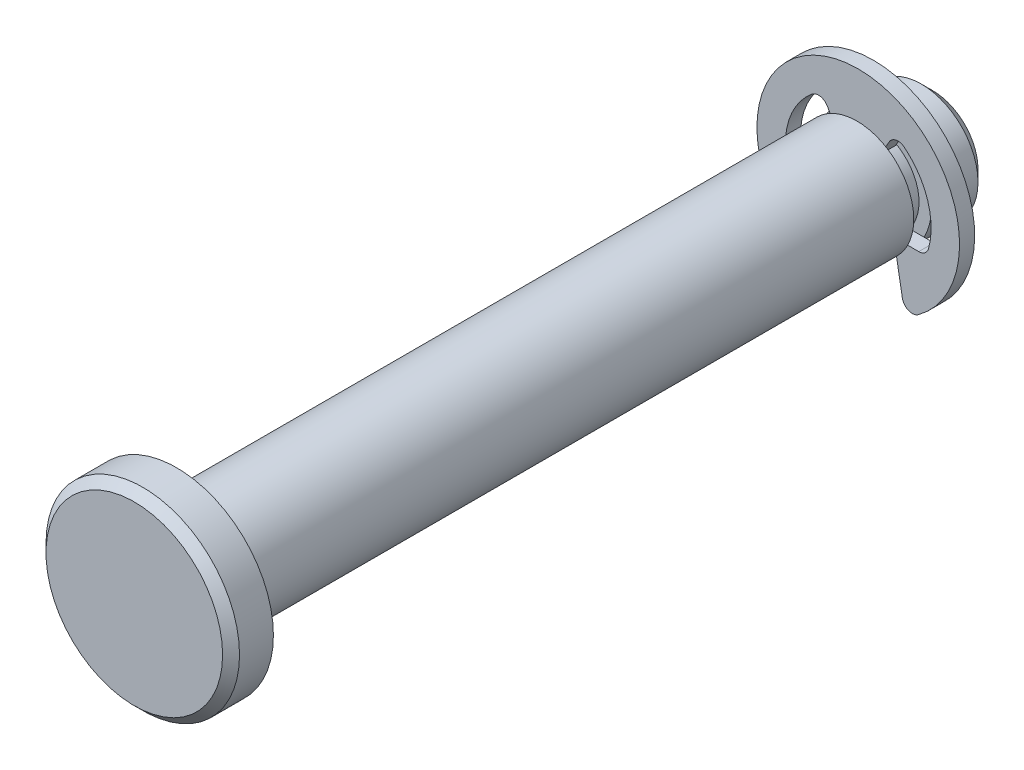
ISO-10303-21;
HEADER;
FILE_DESCRIPTION(('STEP AP214'),'2;1');
FILE_NAME('part.step','',(''),(''),'','','');
FILE_SCHEMA(('AUTOMOTIVE_DESIGN { 1 0 10303 214 1 1 1 1 }'));
ENDSEC;
DATA;
#1=APPLICATION_CONTEXT('core data for automotive mechanical design processes');
#2=APPLICATION_PROTOCOL_DEFINITION('international standard','automotive_design',2000,#1);
#3=PRODUCT_CONTEXT('',#1,'mechanical');
#4=PRODUCT('Part','Part','',(#3));
#5=PRODUCT_RELATED_PRODUCT_CATEGORY('part','',(#4));
#6=PRODUCT_DEFINITION_FORMATION('','',#4);
#7=PRODUCT_DEFINITION_CONTEXT('part definition',#1,'design');
#8=PRODUCT_DEFINITION('design','',#6,#7);
#9=PRODUCT_DEFINITION_SHAPE('','',#8);
#10=(LENGTH_UNIT() NAMED_UNIT(*) SI_UNIT(.MILLI.,.METRE.));
#11=(NAMED_UNIT(*) PLANE_ANGLE_UNIT() SI_UNIT($,.RADIAN.));
#12=(NAMED_UNIT(*) SI_UNIT($,.STERADIAN.) SOLID_ANGLE_UNIT());
#13=UNCERTAINTY_MEASURE_WITH_UNIT(LENGTH_MEASURE(1.E-05),#10,'distance_accuracy_value','');
#14=(GEOMETRIC_REPRESENTATION_CONTEXT(3) GLOBAL_UNCERTAINTY_ASSIGNED_CONTEXT((#13)) GLOBAL_UNIT_ASSIGNED_CONTEXT((#10,
#11,#12)) REPRESENTATION_CONTEXT('',''));
#15=CARTESIAN_POINT('',(0.,0.,0.));
#16=DIRECTION('',(0.,0.,1.));
#17=DIRECTION('',(1.,0.,0.));
#18=AXIS2_PLACEMENT_3D('',#15,#16,#17);
#19=CARTESIAN_POINT('',(0.,0.,-12.7508));
#20=DIRECTION('',(0.,0.,1.));
#21=DIRECTION('',(1.,0.,0.));
#22=AXIS2_PLACEMENT_3D('',#19,#20,#21);
#23=PLANE('',#22);
#24=DIRECTION('',(-0.173648177666931,0.984807753012208,0.));
#25=VECTOR('',#24,1.);
#26=CARTESIAN_POINT('',(1.25692963982568,0.22163060835344,-12.7508));
#27=LINE('',#26,#25);
#28=CARTESIAN_POINT('',(1.85256069501915,-3.15636096616503,-12.7508));
#29=VERTEX_POINT('',#28);
#30=CARTESIAN_POINT('',(1.49352,-1.12014,-12.7508));
#31=VERTEX_POINT('',#30);
#32=EDGE_CURVE('E199',#29,#31,#27,.T.);
#33=ORIENTED_EDGE('',*,*,#32,.F.);
#34=CARTESIAN_POINT('',(2.2715471535382,-3.08248234897663,-12.7508));
#35=DIRECTION('',(0.,0.,1.));
#36=DIRECTION('',(1.,0.,0.));
#37=AXIS2_PLACEMENT_3D('',#34,#35,#36);
#38=CIRCLE('',#37,0.42545);
#39=CARTESIAN_POINT('',(2.52394128170911,-3.42498038775182,-12.7508));
#40=VERTEX_POINT('',#39);
#41=EDGE_CURVE('E253',#29,#40,#38,.T.);
#42=ORIENTED_EDGE('',*,*,#41,.T.);
#43=CARTESIAN_POINT('',(0.,0.,-12.7508));
#44=DIRECTION('',(0.,0.,1.));
#45=DIRECTION('',(1.,0.,0.));
#46=AXIS2_PLACEMENT_3D('',#43,#44,#45);
#47=CIRCLE('',#46,4.2545);
#48=CARTESIAN_POINT('',(-2.52394128170911,-3.42498038775182,-12.7508));
#49=VERTEX_POINT('',#48);
#50=EDGE_CURVE('E179',#40,#49,#47,.T.);
#51=ORIENTED_EDGE('',*,*,#50,.T.);
#52=CARTESIAN_POINT('',(-2.2715471535382,-3.08248234897663,-12.7508));
#53=DIRECTION('',(0.,0.,1.));
#54=DIRECTION('',(1.,0.,0.));
#55=AXIS2_PLACEMENT_3D('',#52,#53,#54);
#56=CIRCLE('',#55,0.42545);
#57=CARTESIAN_POINT('',(-1.85256069501915,-3.15636096616503,-12.7508));
#58=VERTEX_POINT('',#57);
#59=EDGE_CURVE('E251',#49,#58,#56,.T.);
#60=ORIENTED_EDGE('',*,*,#59,.T.);
#61=DIRECTION('',(-0.173648177666931,-0.984807753012208,0.));
#62=VECTOR('',#61,1.);
#63=CARTESIAN_POINT('',(-1.25692963982568,0.22163060835344,-12.7508));
#64=LINE('',#63,#62);
#65=CARTESIAN_POINT('',(-1.49352,-1.12014,-12.7508));
#66=VERTEX_POINT('',#65);
#67=EDGE_CURVE('E195',#66,#58,#64,.T.);
#68=ORIENTED_EDGE('',*,*,#67,.F.);
#69=DIRECTION('',(1.,0.,0.));
#70=VECTOR('',#69,1.);
#71=CARTESIAN_POINT('',(0.,-1.12014,-12.7508));
#72=LINE('',#71,#70);
#73=CARTESIAN_POINT('',(-2.54203626378539,-1.12014,-12.7508));
#74=VERTEX_POINT('',#73);
#75=EDGE_CURVE('E186',#74,#66,#72,.T.);
#76=ORIENTED_EDGE('',*,*,#75,.F.);
#77=CARTESIAN_POINT('',(-2.54203626378539,-0.69469,-12.7508));
#78=DIRECTION('',(0.,0.,1.));
#79=DIRECTION('',(1.,0.,0.));
#80=AXIS2_PLACEMENT_3D('',#77,#78,#79);
#81=CIRCLE('',#80,0.42545);
#82=CARTESIAN_POINT('',(-2.95243729914352,-0.806844771084337,-12.7508));
#83=VERTEX_POINT('',#82);
#84=EDGE_CURVE('E51',#74,#83,#81,.F.);
#85=ORIENTED_EDGE('',*,*,#84,.T.);
#86=CARTESIAN_POINT('',(0.,0.,-12.7508));
#87=DIRECTION('',(0.,0.,1.));
#88=DIRECTION('',(1.,0.,0.));
#89=AXIS2_PLACEMENT_3D('',#86,#87,#88);
#90=CIRCLE('',#89,3.0607);
#91=CARTESIAN_POINT('',(-1.93820951958955,2.36880314677528,-12.7508));
#92=VERTEX_POINT('',#91);
#93=EDGE_CURVE('E211',#92,#83,#90,.T.);
#94=ORIENTED_EDGE('',*,*,#93,.F.);
#95=CARTESIAN_POINT('',(-1.66879035400345,2.03952968031481,-12.7508));
#96=DIRECTION('',(0.,0.,1.));
#97=DIRECTION('',(1.,0.,0.));
#98=AXIS2_PLACEMENT_3D('',#95,#96,#97);
#99=CIRCLE('',#98,0.42545);
#100=CARTESIAN_POINT('',(-1.30033984596336,2.25225468031482,-12.7508));
#101=VERTEX_POINT('',#100);
#102=EDGE_CURVE('E183',#92,#101,#99,.F.);
#103=ORIENTED_EDGE('',*,*,#102,.T.);
#104=DIRECTION('',(-0.500000000000002,0.866025403784438,0.));
#105=VECTOR('',#104,1.);
#106=CARTESIAN_POINT('',(0.,0.,-12.7508));
#107=LINE('',#106,#105);
#108=CARTESIAN_POINT('',(-0.933450000000003,1.61678282632517,-12.7508));
#109=VERTEX_POINT('',#108);
#110=EDGE_CURVE('E175',#109,#101,#107,.T.);
#111=ORIENTED_EDGE('',*,*,#110,.F.);
#112=DIRECTION('',(1.,0.,0.));
#113=VECTOR('',#112,1.);
#114=CARTESIAN_POINT('',(-0.933450000000003,1.61678282632517,-12.7508));
#115=LINE('',#114,#113);
#116=CARTESIAN_POINT('',(0.933450000000003,1.61678282632517,-12.7508));
#117=VERTEX_POINT('',#116);
#118=EDGE_CURVE('E159',#109,#117,#115,.T.);
#119=ORIENTED_EDGE('',*,*,#118,.T.);
#120=DIRECTION('',(-0.500000000000002,-0.866025403784438,0.));
#121=VECTOR('',#120,1.);
#122=CARTESIAN_POINT('',(0.,0.,-12.7508));
#123=LINE('',#122,#121);
#124=CARTESIAN_POINT('',(1.30033984596336,2.25225468031482,-12.7508));
#125=VERTEX_POINT('',#124);
#126=EDGE_CURVE('E209',#125,#117,#123,.T.);
#127=ORIENTED_EDGE('',*,*,#126,.F.);
#128=CARTESIAN_POINT('',(1.66879035400345,2.03952968031482,-12.7508));
#129=DIRECTION('',(0.,0.,1.));
#130=DIRECTION('',(1.,0.,0.));
#131=AXIS2_PLACEMENT_3D('',#128,#129,#130);
#132=CIRCLE('',#131,0.42545);
#133=CARTESIAN_POINT('',(1.93820951958955,2.36880314677528,-12.7508));
#134=VERTEX_POINT('',#133);
#135=EDGE_CURVE('E268',#125,#134,#132,.F.);
#136=ORIENTED_EDGE('',*,*,#135,.T.);
#137=CARTESIAN_POINT('',(0.,0.,-12.7508));
#138=DIRECTION('',(0.,0.,1.));
#139=DIRECTION('',(1.,0.,0.));
#140=AXIS2_PLACEMENT_3D('',#137,#138,#139);
#141=CIRCLE('',#140,3.0607);
#142=CARTESIAN_POINT('',(2.95243729914352,-0.806844771084337,-12.7508));
#143=VERTEX_POINT('',#142);
#144=EDGE_CURVE('E214',#143,#134,#141,.T.);
#145=ORIENTED_EDGE('',*,*,#144,.F.);
#146=CARTESIAN_POINT('',(2.54203626378539,-0.69469,-12.7508));
#147=DIRECTION('',(0.,0.,1.));
#148=DIRECTION('',(1.,0.,0.));
#149=AXIS2_PLACEMENT_3D('',#146,#147,#148);
#150=CIRCLE('',#149,0.42545);
#151=CARTESIAN_POINT('',(2.54203626378539,-1.12014,-12.7508));
#152=VERTEX_POINT('',#151);
#153=EDGE_CURVE('E264',#143,#152,#150,.F.);
#154=ORIENTED_EDGE('',*,*,#153,.T.);
#155=DIRECTION('',(1.,0.,0.));
#156=VECTOR('',#155,1.);
#157=CARTESIAN_POINT('',(0.,-1.12014,-12.7508));
#158=LINE('',#157,#156);
#159=EDGE_CURVE('E204',#31,#152,#158,.T.);
#160=ORIENTED_EDGE('',*,*,#159,.F.);
#161=EDGE_LOOP('',(#33,#42,#51,#60,#68,#76,#85,#94,#103,#111,#119,#127,#136,#145,#154,#160));
#162=FACE_BOUND('',#161,.T.);
#163=ADVANCED_FACE('F43',(#162),#23,.T.);
#164=CARTESIAN_POINT('',(0.,0.,-13.3858));
#165=DIRECTION('',(0.,0.,1.));
#166=DIRECTION('',(1.,0.,0.));
#167=AXIS2_PLACEMENT_3D('',#164,#165,#166);
#168=PLANE('',#167);
#169=CARTESIAN_POINT('',(0.,0.,-13.3858));
#170=DIRECTION('',(0.,0.,1.));
#171=DIRECTION('',(1.,0.,0.));
#172=AXIS2_PLACEMENT_3D('',#169,#170,#171);
#173=CIRCLE('',#172,4.2545);
#174=CARTESIAN_POINT('',(2.52394128170911,-3.42498038775182,-13.3858));
#175=VERTEX_POINT('',#174);
#176=CARTESIAN_POINT('',(-2.52394128170911,-3.42498038775182,-13.3858));
#177=VERTEX_POINT('',#176);
#178=EDGE_CURVE('E217',#175,#177,#173,.T.);
#179=ORIENTED_EDGE('',*,*,#178,.F.);
#180=CARTESIAN_POINT('',(2.2715471535382,-3.08248234897663,-13.3858));
#181=DIRECTION('',(0.,0.,1.));
#182=DIRECTION('',(1.,0.,0.));
#183=AXIS2_PLACEMENT_3D('',#180,#181,#182);
#184=CIRCLE('',#183,0.42545);
#185=CARTESIAN_POINT('',(1.85256069501915,-3.15636096616503,-13.3858));
#186=VERTEX_POINT('',#185);
#187=EDGE_CURVE('E261',#175,#186,#184,.F.);
#188=ORIENTED_EDGE('',*,*,#187,.T.);
#189=DIRECTION('',(-0.173648177666931,0.984807753012208,0.));
#190=VECTOR('',#189,1.);
#191=CARTESIAN_POINT('',(1.25692963982568,0.22163060835344,-13.3858));
#192=LINE('',#191,#190);
#193=CARTESIAN_POINT('',(1.49352,-1.12014,-13.3858));
#194=VERTEX_POINT('',#193);
#195=EDGE_CURVE('E197',#186,#194,#192,.T.);
#196=ORIENTED_EDGE('',*,*,#195,.T.);
#197=DIRECTION('',(1.,0.,0.));
#198=VECTOR('',#197,1.);
#199=CARTESIAN_POINT('',(0.,-1.12014,-13.3858));
#200=LINE('',#199,#198);
#201=CARTESIAN_POINT('',(2.54203626378539,-1.12014,-13.3858));
#202=VERTEX_POINT('',#201);
#203=EDGE_CURVE('E201',#194,#202,#200,.T.);
#204=ORIENTED_EDGE('',*,*,#203,.T.);
#205=CARTESIAN_POINT('',(2.54203626378539,-0.69469,-13.3858));
#206=DIRECTION('',(0.,0.,1.));
#207=DIRECTION('',(1.,0.,0.));
#208=AXIS2_PLACEMENT_3D('',#205,#206,#207);
#209=CIRCLE('',#208,0.42545);
#210=CARTESIAN_POINT('',(2.95243729914352,-0.806844771084337,-13.3858));
#211=VERTEX_POINT('',#210);
#212=EDGE_CURVE('E266',#202,#211,#209,.T.);
#213=ORIENTED_EDGE('',*,*,#212,.T.);
#214=CARTESIAN_POINT('',(0.,0.,-13.3858));
#215=DIRECTION('',(0.,0.,1.));
#216=DIRECTION('',(1.,0.,0.));
#217=AXIS2_PLACEMENT_3D('',#214,#215,#216);
#218=CIRCLE('',#217,3.0607);
#219=CARTESIAN_POINT('',(1.93820951958955,2.36880314677528,-13.3858));
#220=VERTEX_POINT('',#219);
#221=EDGE_CURVE('E225',#211,#220,#218,.T.);
#222=ORIENTED_EDGE('',*,*,#221,.T.);
#223=CARTESIAN_POINT('',(1.66879035400345,2.03952968031482,-13.3858));
#224=DIRECTION('',(0.,0.,1.));
#225=DIRECTION('',(1.,0.,0.));
#226=AXIS2_PLACEMENT_3D('',#223,#224,#225);
#227=CIRCLE('',#226,0.42545);
#228=CARTESIAN_POINT('',(1.30033984596336,2.25225468031482,-13.3858));
#229=VERTEX_POINT('',#228);
#230=EDGE_CURVE('E270',#220,#229,#227,.T.);
#231=ORIENTED_EDGE('',*,*,#230,.T.);
#232=DIRECTION('',(-0.500000000000002,-0.866025403784438,0.));
#233=VECTOR('',#232,1.);
#234=CARTESIAN_POINT('',(0.,0.,-13.3858));
#235=LINE('',#234,#233);
#236=CARTESIAN_POINT('',(0.933450000000003,1.61678282632517,-13.3858));
#237=VERTEX_POINT('',#236);
#238=EDGE_CURVE('E207',#229,#237,#235,.T.);
#239=ORIENTED_EDGE('',*,*,#238,.T.);
#240=DIRECTION('',(-1.,0.,0.));
#241=VECTOR('',#240,1.);
#242=CARTESIAN_POINT('',(-0.933450000000003,1.61678282632517,-13.3858));
#243=LINE('',#242,#241);
#244=CARTESIAN_POINT('',(-0.933450000000003,1.61678282632517,-13.3858));
#245=VERTEX_POINT('',#244);
#246=EDGE_CURVE('E170',#237,#245,#243,.T.);
#247=ORIENTED_EDGE('',*,*,#246,.T.);
#248=DIRECTION('',(-0.500000000000002,0.866025403784438,0.));
#249=VECTOR('',#248,1.);
#250=CARTESIAN_POINT('',(0.,0.,-13.3858));
#251=LINE('',#250,#249);
#252=CARTESIAN_POINT('',(-1.30033984596336,2.25225468031482,-13.3858));
#253=VERTEX_POINT('',#252);
#254=EDGE_CURVE('E178',#245,#253,#251,.T.);
#255=ORIENTED_EDGE('',*,*,#254,.T.);
#256=CARTESIAN_POINT('',(-1.66879035400345,2.03952968031481,-13.3858));
#257=DIRECTION('',(0.,0.,1.));
#258=DIRECTION('',(1.,0.,0.));
#259=AXIS2_PLACEMENT_3D('',#256,#257,#258);
#260=CIRCLE('',#259,0.42545);
#261=CARTESIAN_POINT('',(-1.93820951958955,2.36880314677528,-13.3858));
#262=VERTEX_POINT('',#261);
#263=EDGE_CURVE('E273',#253,#262,#260,.T.);
#264=ORIENTED_EDGE('',*,*,#263,.T.);
#265=CARTESIAN_POINT('',(0.,0.,-13.3858));
#266=DIRECTION('',(0.,0.,1.));
#267=DIRECTION('',(1.,0.,0.));
#268=AXIS2_PLACEMENT_3D('',#265,#266,#267);
#269=CIRCLE('',#268,3.0607);
#270=CARTESIAN_POINT('',(-2.95243729914352,-0.806844771084337,-13.3858));
#271=VERTEX_POINT('',#270);
#272=EDGE_CURVE('E222',#262,#271,#269,.T.);
#273=ORIENTED_EDGE('',*,*,#272,.T.);
#274=CARTESIAN_POINT('',(-2.54203626378539,-0.69469,-13.3858));
#275=DIRECTION('',(0.,0.,1.));
#276=DIRECTION('',(1.,0.,0.));
#277=AXIS2_PLACEMENT_3D('',#274,#275,#276);
#278=CIRCLE('',#277,0.42545);
#279=CARTESIAN_POINT('',(-2.54203626378539,-1.12014,-13.3858));
#280=VERTEX_POINT('',#279);
#281=EDGE_CURVE('E12',#271,#280,#278,.T.);
#282=ORIENTED_EDGE('',*,*,#281,.T.);
#283=DIRECTION('',(1.,0.,0.));
#284=VECTOR('',#283,1.);
#285=CARTESIAN_POINT('',(0.,-1.12014,-13.3858));
#286=LINE('',#285,#284);
#287=CARTESIAN_POINT('',(-1.49352,-1.12014,-13.3858));
#288=VERTEX_POINT('',#287);
#289=EDGE_CURVE('E184',#280,#288,#286,.T.);
#290=ORIENTED_EDGE('',*,*,#289,.T.);
#291=DIRECTION('',(-0.173648177666931,-0.984807753012208,0.));
#292=VECTOR('',#291,1.);
#293=CARTESIAN_POINT('',(-1.25692963982568,0.22163060835344,-13.3858));
#294=LINE('',#293,#292);
#295=CARTESIAN_POINT('',(-1.85256069501915,-3.15636096616503,-13.3858));
#296=VERTEX_POINT('',#295);
#297=EDGE_CURVE('E193',#288,#296,#294,.T.);
#298=ORIENTED_EDGE('',*,*,#297,.T.);
#299=CARTESIAN_POINT('',(-2.2715471535382,-3.08248234897663,-13.3858));
#300=DIRECTION('',(0.,0.,1.));
#301=DIRECTION('',(1.,0.,0.));
#302=AXIS2_PLACEMENT_3D('',#299,#300,#301);
#303=CIRCLE('',#302,0.42545);
#304=EDGE_CURVE('E65',#296,#177,#303,.F.);
#305=ORIENTED_EDGE('',*,*,#304,.T.);
#306=EDGE_LOOP('',(#179,#188,#196,#204,#213,#222,#231,#239,#247,#255,#264,#273,#282,#290,#298,#305));
#307=FACE_BOUND('',#306,.T.);
#308=ADVANCED_FACE('F286',(#307),#168,.F.);
#309=CARTESIAN_POINT('',(0.,0.,-12.7508));
#310=DIRECTION('',(0.,0.,-1.));
#311=DIRECTION('',(-1.,0.,0.));
#312=AXIS2_PLACEMENT_3D('',#309,#310,#311);
#313=CYLINDRICAL_SURFACE('',#312,4.2545);
#314=ORIENTED_EDGE('',*,*,#50,.F.);
#315=DIRECTION('',(0.,0.,-1.));
#316=VECTOR('',#315,1.);
#317=CARTESIAN_POINT('',(2.52394128170911,-3.42498038775182,-12.7508));
#318=LINE('',#317,#316);
#319=EDGE_CURVE('E258',#40,#175,#318,.T.);
#320=ORIENTED_EDGE('',*,*,#319,.T.);
#321=ORIENTED_EDGE('',*,*,#178,.T.);
#322=DIRECTION('',(0.,0.,-1.));
#323=VECTOR('',#322,1.);
#324=CARTESIAN_POINT('',(-2.52394128170911,-3.42498038775182,-12.7508));
#325=LINE('',#324,#323);
#326=EDGE_CURVE('E255',#177,#49,#325,.F.);
#327=ORIENTED_EDGE('',*,*,#326,.T.);
#328=EDGE_LOOP('',(#314,#320,#321,#327));
#329=FACE_BOUND('',#328,.T.);
#330=ADVANCED_FACE('F326',(#329),#313,.T.);
#331=CARTESIAN_POINT('',(-1.49352,-1.12014,-15.875));
#332=DIRECTION('',(-0.984807753012208,0.173648177666931,0.));
#333=DIRECTION('',(-0.173648177666931,-0.984807753012208,0.));
#334=AXIS2_PLACEMENT_3D('',#331,#332,#333);
#335=PLANE('',#334);
#336=ORIENTED_EDGE('',*,*,#67,.T.);
#337=DIRECTION('',(0.,0.,-1.));
#338=VECTOR('',#337,1.);
#339=CARTESIAN_POINT('',(-1.85256069501915,-3.15636096616503,-15.875));
#340=LINE('',#339,#338);
#341=EDGE_CURVE('E58',#58,#296,#340,.T.);
#342=ORIENTED_EDGE('',*,*,#341,.T.);
#343=ORIENTED_EDGE('',*,*,#297,.F.);
#344=DIRECTION('',(0.,0.,1.));
#345=VECTOR('',#344,1.);
#346=CARTESIAN_POINT('',(-1.49352,-1.12014,-15.875));
#347=LINE('',#346,#345);
#348=EDGE_CURVE('E291',#288,#66,#347,.T.);
#349=ORIENTED_EDGE('',*,*,#348,.T.);
#350=EDGE_LOOP('',(#336,#342,#343,#349));
#351=FACE_BOUND('',#350,.T.);
#352=ADVANCED_FACE('F331',(#351),#335,.F.);
#353=CARTESIAN_POINT('',(-1.53035,2.65064395336303,-15.875));
#354=DIRECTION('',(0.866025403784438,0.500000000000002,0.));
#355=DIRECTION('',(-0.500000000000002,0.866025403784438,0.));
#356=AXIS2_PLACEMENT_3D('',#353,#354,#355);
#357=PLANE('',#356);
#358=ORIENTED_EDGE('',*,*,#110,.T.);
#359=DIRECTION('',(0.,0.,-1.));
#360=VECTOR('',#359,1.);
#361=CARTESIAN_POINT('',(-1.30033984596336,2.25225468031482,-13.3858));
#362=LINE('',#361,#360);
#363=EDGE_CURVE('E243',#101,#253,#362,.T.);
#364=ORIENTED_EDGE('',*,*,#363,.T.);
#365=ORIENTED_EDGE('',*,*,#254,.F.);
#366=DIRECTION('',(0.,0.,-1.));
#367=VECTOR('',#366,1.);
#368=CARTESIAN_POINT('',(-0.933450000000003,1.61678282632517,-12.7508));
#369=LINE('',#368,#367);
#370=EDGE_CURVE('E163',#245,#109,#369,.F.);
#371=ORIENTED_EDGE('',*,*,#370,.T.);
#372=EDGE_LOOP('',(#358,#364,#365,#371));
#373=FACE_BOUND('',#372,.T.);
#374=ADVANCED_FACE('F174',(#373),#357,.F.);
#375=CARTESIAN_POINT('',(0.,0.,-15.875));
#376=DIRECTION('',(0.,0.,1.));
#377=DIRECTION('',(1.,0.,0.));
#378=AXIS2_PLACEMENT_3D('',#375,#376,#377);
#379=CYLINDRICAL_SURFACE('',#378,3.0607);
#380=ORIENTED_EDGE('',*,*,#272,.F.);
#381=DIRECTION('',(0.,0.,1.));
#382=VECTOR('',#381,1.);
#383=CARTESIAN_POINT('',(-1.93820951958955,2.36880314677528,-15.875));
#384=LINE('',#383,#382);
#385=EDGE_CURVE('E240',#262,#92,#384,.T.);
#386=ORIENTED_EDGE('',*,*,#385,.T.);
#387=ORIENTED_EDGE('',*,*,#93,.T.);
#388=DIRECTION('',(0.,0.,1.));
#389=VECTOR('',#388,1.);
#390=CARTESIAN_POINT('',(-2.95243729914352,-0.806844771084337,-15.875));
#391=LINE('',#390,#389);
#392=EDGE_CURVE('E238',#83,#271,#391,.F.);
#393=ORIENTED_EDGE('',*,*,#392,.T.);
#394=EDGE_LOOP('',(#380,#386,#387,#393));
#395=FACE_BOUND('',#394,.T.);
#396=ADVANCED_FACE('F281',(#395),#379,.F.);
#397=CARTESIAN_POINT('',(-2.84836284036989,-1.12014,-15.875));
#398=DIRECTION('',(0.,-1.,0.));
#399=DIRECTION('',(0.,0.,-1.));
#400=AXIS2_PLACEMENT_3D('',#397,#398,#399);
#401=PLANE('',#400);
#402=ORIENTED_EDGE('',*,*,#289,.F.);
#403=DIRECTION('',(0.,0.,-1.));
#404=VECTOR('',#403,1.);
#405=CARTESIAN_POINT('',(-2.54203626378539,-1.12014,-12.7508));
#406=LINE('',#405,#404);
#407=EDGE_CURVE('E245',#280,#74,#406,.F.);
#408=ORIENTED_EDGE('',*,*,#407,.T.);
#409=ORIENTED_EDGE('',*,*,#75,.T.);
#410=ORIENTED_EDGE('',*,*,#348,.F.);
#411=EDGE_LOOP('',(#402,#408,#409,#410));
#412=FACE_BOUND('',#411,.T.);
#413=ADVANCED_FACE('F289',(#412),#401,.F.);
#414=CARTESIAN_POINT('',(0.,0.,-15.875));
#415=DIRECTION('',(0.,0.,1.));
#416=DIRECTION('',(1.,0.,0.));
#417=AXIS2_PLACEMENT_3D('',#414,#415,#416);
#418=CYLINDRICAL_SURFACE('',#417,3.0607);
#419=ORIENTED_EDGE('',*,*,#221,.F.);
#420=DIRECTION('',(0.,0.,1.));
#421=VECTOR('',#420,1.);
#422=CARTESIAN_POINT('',(2.95243729914352,-0.806844771084337,-15.875));
#423=LINE('',#422,#421);
#424=EDGE_CURVE('E230',#211,#143,#423,.T.);
#425=ORIENTED_EDGE('',*,*,#424,.T.);
#426=ORIENTED_EDGE('',*,*,#144,.T.);
#427=DIRECTION('',(0.,0.,1.));
#428=VECTOR('',#427,1.);
#429=CARTESIAN_POINT('',(1.93820951958955,2.36880314677528,-15.875));
#430=LINE('',#429,#428);
#431=EDGE_CURVE('E228',#134,#220,#430,.F.);
#432=ORIENTED_EDGE('',*,*,#431,.T.);
#433=EDGE_LOOP('',(#419,#425,#426,#432));
#434=FACE_BOUND('',#433,.T.);
#435=ADVANCED_FACE('F305',(#434),#418,.F.);
#436=CARTESIAN_POINT('',(1.49352,-1.12014,-15.875));
#437=DIRECTION('',(0.,-1.,0.));
#438=DIRECTION('',(0.,0.,-1.));
#439=AXIS2_PLACEMENT_3D('',#436,#437,#438);
#440=PLANE('',#439);
#441=ORIENTED_EDGE('',*,*,#159,.T.);
#442=DIRECTION('',(0.,0.,-1.));
#443=VECTOR('',#442,1.);
#444=CARTESIAN_POINT('',(2.54203626378539,-1.12014,-13.3858));
#445=LINE('',#444,#443);
#446=EDGE_CURVE('E233',#152,#202,#445,.T.);
#447=ORIENTED_EDGE('',*,*,#446,.T.);
#448=ORIENTED_EDGE('',*,*,#203,.F.);
#449=DIRECTION('',(0.,0.,1.));
#450=VECTOR('',#449,1.);
#451=CARTESIAN_POINT('',(1.49352,-1.12014,-15.875));
#452=LINE('',#451,#450);
#453=EDGE_CURVE('E188',#194,#31,#452,.T.);
#454=ORIENTED_EDGE('',*,*,#453,.T.);
#455=EDGE_LOOP('',(#441,#447,#448,#454));
#456=FACE_BOUND('',#455,.T.);
#457=ADVANCED_FACE('F315',(#456),#440,.F.);
#458=CARTESIAN_POINT('',(1.49352,-1.12014,-15.875));
#459=DIRECTION('',(0.984807753012208,0.173648177666931,0.));
#460=DIRECTION('',(-0.173648177666931,0.984807753012208,0.));
#461=AXIS2_PLACEMENT_3D('',#458,#459,#460);
#462=PLANE('',#461);
#463=ORIENTED_EDGE('',*,*,#195,.F.);
#464=DIRECTION('',(0.,0.,-1.));
#465=VECTOR('',#464,1.);
#466=CARTESIAN_POINT('',(1.85256069501915,-3.15636096616503,-15.875));
#467=LINE('',#466,#465);
#468=EDGE_CURVE('E248',#186,#29,#467,.F.);
#469=ORIENTED_EDGE('',*,*,#468,.T.);
#470=ORIENTED_EDGE('',*,*,#32,.T.);
#471=ORIENTED_EDGE('',*,*,#453,.F.);
#472=EDGE_LOOP('',(#463,#469,#470,#471));
#473=FACE_BOUND('',#472,.T.);
#474=ADVANCED_FACE('F320',(#473),#462,.F.);
#475=CARTESIAN_POINT('',(0.,0.,-15.875));
#476=DIRECTION('',(-0.866025403784438,0.500000000000002,0.));
#477=DIRECTION('',(-0.500000000000002,-0.866025403784438,0.));
#478=AXIS2_PLACEMENT_3D('',#475,#476,#477);
#479=PLANE('',#478);
#480=ORIENTED_EDGE('',*,*,#238,.F.);
#481=DIRECTION('',(0.,0.,-1.));
#482=VECTOR('',#481,1.);
#483=CARTESIAN_POINT('',(1.30033984596336,2.25225468031482,-12.7508));
#484=LINE('',#483,#482);
#485=EDGE_CURVE('E235',#229,#125,#484,.F.);
#486=ORIENTED_EDGE('',*,*,#485,.T.);
#487=ORIENTED_EDGE('',*,*,#126,.T.);
#488=DIRECTION('',(0.,0.,-1.));
#489=VECTOR('',#488,1.);
#490=CARTESIAN_POINT('',(0.933450000000003,1.61678282632517,-12.7508));
#491=LINE('',#490,#489);
#492=EDGE_CURVE('E166',#117,#237,#491,.T.);
#493=ORIENTED_EDGE('',*,*,#492,.T.);
#494=EDGE_LOOP('',(#480,#486,#487,#493));
#495=FACE_BOUND('',#494,.T.);
#496=ADVANCED_FACE('F298',(#495),#479,.F.);
#497=CARTESIAN_POINT('',(-0.933450000000003,1.61678282632517,-15.2693801577228));
#498=DIRECTION('',(0.,-1.,0.));
#499=DIRECTION('',(0.,0.,-1.));
#500=AXIS2_PLACEMENT_3D('',#497,#498,#499);
#501=PLANE('',#500);
#502=ORIENTED_EDGE('',*,*,#246,.F.);
#503=ORIENTED_EDGE('',*,*,#492,.F.);
#504=ORIENTED_EDGE('',*,*,#118,.F.);
#505=ORIENTED_EDGE('',*,*,#370,.F.);
#506=EDGE_LOOP('',(#502,#503,#504,#505));
#507=FACE_BOUND('',#506,.T.);
#508=ADVANCED_FACE('F162',(#507),#501,.T.);
#509=CARTESIAN_POINT('',(2.54203626378539,-0.69469,-15.875));
#510=DIRECTION('',(0.,0.,1.));
#511=DIRECTION('',(1.,0.,0.));
#512=AXIS2_PLACEMENT_3D('',#509,#510,#511);
#513=CYLINDRICAL_SURFACE('',#512,0.42545);
#514=ORIENTED_EDGE('',*,*,#212,.F.);
#515=ORIENTED_EDGE('',*,*,#446,.F.);
#516=ORIENTED_EDGE('',*,*,#153,.F.);
#517=ORIENTED_EDGE('',*,*,#424,.F.);
#518=EDGE_LOOP('',(#514,#515,#516,#517));
#519=FACE_BOUND('',#518,.T.);
#520=ADVANCED_FACE('F311',(#519),#513,.F.);
#521=CARTESIAN_POINT('',(1.66879035400345,2.03952968031482,-15.875));
#522=DIRECTION('',(0.,0.,1.));
#523=DIRECTION('',(1.,0.,0.));
#524=AXIS2_PLACEMENT_3D('',#521,#522,#523);
#525=CYLINDRICAL_SURFACE('',#524,0.42545);
#526=ORIENTED_EDGE('',*,*,#230,.F.);
#527=ORIENTED_EDGE('',*,*,#431,.F.);
#528=ORIENTED_EDGE('',*,*,#135,.F.);
#529=ORIENTED_EDGE('',*,*,#485,.F.);
#530=EDGE_LOOP('',(#526,#527,#528,#529));
#531=FACE_BOUND('',#530,.T.);
#532=ADVANCED_FACE('F308',(#531),#525,.F.);
#533=CARTESIAN_POINT('',(-1.66879035400345,2.03952968031481,-15.875));
#534=DIRECTION('',(0.,0.,1.));
#535=DIRECTION('',(1.,0.,0.));
#536=AXIS2_PLACEMENT_3D('',#533,#534,#535);
#537=CYLINDRICAL_SURFACE('',#536,0.42545);
#538=ORIENTED_EDGE('',*,*,#263,.F.);
#539=ORIENTED_EDGE('',*,*,#363,.F.);
#540=ORIENTED_EDGE('',*,*,#102,.F.);
#541=ORIENTED_EDGE('',*,*,#385,.F.);
#542=EDGE_LOOP('',(#538,#539,#540,#541));
#543=FACE_BOUND('',#542,.T.);
#544=ADVANCED_FACE('F354',(#543),#537,.F.);
#545=CARTESIAN_POINT('',(-2.54203626378539,-0.69469,-15.875));
#546=DIRECTION('',(0.,0.,1.));
#547=DIRECTION('',(1.,0.,0.));
#548=AXIS2_PLACEMENT_3D('',#545,#546,#547);
#549=CYLINDRICAL_SURFACE('',#548,0.42545);
#550=ORIENTED_EDGE('',*,*,#281,.F.);
#551=ORIENTED_EDGE('',*,*,#392,.F.);
#552=ORIENTED_EDGE('',*,*,#84,.F.);
#553=ORIENTED_EDGE('',*,*,#407,.F.);
#554=EDGE_LOOP('',(#550,#551,#552,#553));
#555=FACE_BOUND('',#554,.T.);
#556=ADVANCED_FACE('F284',(#555),#549,.F.);
#557=CARTESIAN_POINT('',(2.2715471535382,-3.08248234897663,-12.7508));
#558=DIRECTION('',(0.,0.,-1.));
#559=DIRECTION('',(-1.,0.,0.));
#560=AXIS2_PLACEMENT_3D('',#557,#558,#559);
#561=CYLINDRICAL_SURFACE('',#560,0.42545);
#562=ORIENTED_EDGE('',*,*,#187,.F.);
#563=ORIENTED_EDGE('',*,*,#319,.F.);
#564=ORIENTED_EDGE('',*,*,#41,.F.);
#565=ORIENTED_EDGE('',*,*,#468,.F.);
#566=EDGE_LOOP('',(#562,#563,#564,#565));
#567=FACE_BOUND('',#566,.T.);
#568=ADVANCED_FACE('F329',(#567),#561,.T.);
#569=CARTESIAN_POINT('',(-2.2715471535382,-3.08248234897663,-12.7508));
#570=DIRECTION('',(0.,0.,-1.));
#571=DIRECTION('',(-1.,0.,0.));
#572=AXIS2_PLACEMENT_3D('',#569,#570,#571);
#573=CYLINDRICAL_SURFACE('',#572,0.42545);
#574=ORIENTED_EDGE('',*,*,#304,.F.);
#575=ORIENTED_EDGE('',*,*,#341,.F.);
#576=ORIENTED_EDGE('',*,*,#59,.F.);
#577=ORIENTED_EDGE('',*,*,#326,.F.);
#578=EDGE_LOOP('',(#574,#575,#576,#577));
#579=FACE_BOUND('',#578,.T.);
#580=ADVANCED_FACE('F45',(#579),#573,.T.);
#581=CLOSED_SHELL('',(#163,#308,#330,#352,#374,#396,#413,#435,#457,#474,#496,#508,#520,#532,
#544,#556,#568,#580));
#582=MANIFOLD_SOLID_BREP('B2',#581);
#583=CARTESIAN_POINT('',(0.,0.,15.875));
#584=DIRECTION('',(0.,0.,-1.));
#585=DIRECTION('',(-1.,0.,0.));
#586=AXIS2_PLACEMENT_3D('',#583,#584,#585);
#587=CYLINDRICAL_SURFACE('',#586,2.38125);
#588=CARTESIAN_POINT('',(0.,0.,15.875));
#589=DIRECTION('',(0.,0.,1.));
#590=DIRECTION('',(1.,0.,0.));
#591=AXIS2_PLACEMENT_3D('',#588,#589,#590);
#592=CIRCLE('',#591,2.38125);
#593=CARTESIAN_POINT('',(2.38125,0.,15.875));
#594=VERTEX_POINT('',#593);
#595=EDGE_CURVE('E506',#594,#594,#592,.T.);
#596=ORIENTED_EDGE('',*,*,#595,.F.);
#597=EDGE_LOOP('',(#596));
#598=FACE_BOUND('',#597,.T.);
#599=CARTESIAN_POINT('',(0.,0.,-12.7));
#600=DIRECTION('',(0.,0.,1.));
#601=DIRECTION('',(1.,0.,0.));
#602=AXIS2_PLACEMENT_3D('',#599,#600,#601);
#603=CIRCLE('',#602,2.38125);
#604=CARTESIAN_POINT('',(2.38125,0.,-12.7));
#605=VERTEX_POINT('',#604);
#606=EDGE_CURVE('E518',#605,#605,#603,.T.);
#607=ORIENTED_EDGE('',*,*,#606,.T.);
#608=EDGE_LOOP('',(#607));
#609=FACE_BOUND('',#608,.T.);
#610=ADVANCED_FACE('F486',(#598,#609),#587,.T.);
#611=CARTESIAN_POINT('',(0.,2.38125,-12.7));
#612=DIRECTION('',(0.,0.,-1.));
#613=DIRECTION('',(-1.,0.,0.));
#614=AXIS2_PLACEMENT_3D('',#611,#612,#613);
#615=PLANE('',#614);
#616=CARTESIAN_POINT('',(0.,0.,-12.7));
#617=DIRECTION('',(0.,0.,1.));
#618=DIRECTION('',(1.,0.,0.));
#619=AXIS2_PLACEMENT_3D('',#616,#617,#618);
#620=CIRCLE('',#619,1.8669);
#621=CARTESIAN_POINT('',(1.8669,0.,-12.7));
#622=VERTEX_POINT('',#621);
#623=EDGE_CURVE('E509',#622,#622,#620,.T.);
#624=ORIENTED_EDGE('',*,*,#623,.T.);
#625=EDGE_LOOP('',(#624));
#626=FACE_BOUND('',#625,.T.);
#627=ORIENTED_EDGE('',*,*,#606,.F.);
#628=EDGE_LOOP('',(#627));
#629=FACE_BOUND('',#628,.T.);
#630=ADVANCED_FACE('F536',(#626,#629),#615,.T.);
#631=CARTESIAN_POINT('',(0.,0.,15.875));
#632=DIRECTION('',(0.,0.,1.));
#633=DIRECTION('',(1.,0.,0.));
#634=AXIS2_PLACEMENT_3D('',#631,#632,#633);
#635=CYLINDRICAL_SURFACE('',#634,1.8669);
#636=CARTESIAN_POINT('',(0.,0.,-13.4366));
#637=DIRECTION('',(0.,0.,1.));
#638=DIRECTION('',(1.,0.,0.));
#639=AXIS2_PLACEMENT_3D('',#636,#637,#638);
#640=CIRCLE('',#639,1.8669);
#641=CARTESIAN_POINT('',(1.8669,0.,-13.4366));
#642=VERTEX_POINT('',#641);
#643=EDGE_CURVE('E512',#642,#642,#640,.T.);
#644=ORIENTED_EDGE('',*,*,#643,.T.);
#645=EDGE_LOOP('',(#644));
#646=FACE_BOUND('',#645,.T.);
#647=ORIENTED_EDGE('',*,*,#623,.F.);
#648=EDGE_LOOP('',(#647));
#649=FACE_BOUND('',#648,.T.);
#650=ADVANCED_FACE('F541',(#646,#649),#635,.T.);
#651=CARTESIAN_POINT('',(0.,2.38125,-13.4366));
#652=DIRECTION('',(0.,0.,1.));
#653=DIRECTION('',(1.,0.,0.));
#654=AXIS2_PLACEMENT_3D('',#651,#652,#653);
#655=PLANE('',#654);
#656=CARTESIAN_POINT('',(0.,0.,-13.4366));
#657=DIRECTION('',(0.,0.,1.));
#658=DIRECTION('',(1.,0.,0.));
#659=AXIS2_PLACEMENT_3D('',#656,#657,#658);
#660=CIRCLE('',#659,2.38125);
#661=CARTESIAN_POINT('',(2.38125,0.,-13.4366));
#662=VERTEX_POINT('',#661);
#663=EDGE_CURVE('E515',#662,#662,#660,.T.);
#664=ORIENTED_EDGE('',*,*,#663,.T.);
#665=EDGE_LOOP('',(#664));
#666=FACE_BOUND('',#665,.T.);
#667=ORIENTED_EDGE('',*,*,#643,.F.);
#668=EDGE_LOOP('',(#667));
#669=FACE_BOUND('',#668,.T.);
#670=ADVANCED_FACE('F547',(#666,#669),#655,.T.);
#671=CARTESIAN_POINT('',(0.,0.,-15.875));
#672=DIRECTION('',(0.,0.,1.));
#673=DIRECTION('',(1.,0.,0.));
#674=AXIS2_PLACEMENT_3D('',#671,#672,#673);
#675=PLANE('',#674);
#676=CARTESIAN_POINT('',(0.,0.,-15.875));
#677=DIRECTION('',(0.,0.,1.));
#678=DIRECTION('',(1.,0.,0.));
#679=AXIS2_PLACEMENT_3D('',#676,#677,#678);
#680=CIRCLE('',#679,1.90499999999999);
#681=CARTESIAN_POINT('',(1.90499999999999,0.,-15.875));
#682=VERTEX_POINT('',#681);
#683=EDGE_CURVE('E42',#682,#682,#680,.F.);
#684=ORIENTED_EDGE('',*,*,#683,.T.);
#685=EDGE_LOOP('',(#684));
#686=FACE_BOUND('',#685,.T.);
#687=ADVANCED_FACE('F552',(#686),#675,.F.);
#688=CARTESIAN_POINT('',(0.,0.,-15.39875));
#689=DIRECTION('',(0.,0.,1.));
#690=DIRECTION('',(1.,0.,0.));
#691=AXIS2_PLACEMENT_3D('',#688,#689,#690);
#692=CIRCLE('',#691,2.38125);
#693=CARTESIAN_POINT('',(2.38125,0.,-15.39875));
#694=VERTEX_POINT('',#693);
#695=EDGE_CURVE('E493',#694,#694,#692,.T.);
#696=ORIENTED_EDGE('',*,*,#695,.T.);
#697=EDGE_LOOP('',(#696));
#698=FACE_BOUND('',#697,.T.);
#699=ORIENTED_EDGE('',*,*,#663,.F.);
#700=EDGE_LOOP('',(#699));
#701=FACE_BOUND('',#700,.T.);
#702=ADVANCED_FACE('F530',(#698,#701),#587,.T.);
#703=CARTESIAN_POINT('',(0.,0.,15.875));
#704=DIRECTION('',(0.,0.,1.));
#705=DIRECTION('',(1.,0.,0.));
#706=AXIS2_PLACEMENT_3D('',#703,#704,#705);
#707=PLANE('',#706);
#708=CARTESIAN_POINT('',(0.,0.,15.875));
#709=DIRECTION('',(0.,0.,1.));
#710=DIRECTION('',(1.,0.,0.));
#711=AXIS2_PLACEMENT_3D('',#708,#709,#710);
#712=CIRCLE('',#711,4.064);
#713=CARTESIAN_POINT('',(4.064,0.,15.875));
#714=VERTEX_POINT('',#713);
#715=EDGE_CURVE('E521',#714,#714,#712,.T.);
#716=ORIENTED_EDGE('',*,*,#715,.F.);
#717=EDGE_LOOP('',(#716));
#718=FACE_BOUND('',#717,.T.);
#719=ORIENTED_EDGE('',*,*,#595,.T.);
#720=EDGE_LOOP('',(#719));
#721=FACE_BOUND('',#720,.T.);
#722=ADVANCED_FACE('F527',(#718,#721),#707,.F.);
#723=CARTESIAN_POINT('',(0.,0.,17.653));
#724=DIRECTION('',(0.,0.,-1.));
#725=DIRECTION('',(-1.,0.,0.));
#726=AXIS2_PLACEMENT_3D('',#723,#724,#725);
#727=CYLINDRICAL_SURFACE('',#726,4.064);
#728=CARTESIAN_POINT('',(0.,0.,17.2974));
#729=DIRECTION('',(0.,0.,1.));
#730=DIRECTION('',(1.,0.,0.));
#731=AXIS2_PLACEMENT_3D('',#728,#729,#730);
#732=CIRCLE('',#731,4.064);
#733=CARTESIAN_POINT('',(4.064,0.,17.2974));
#734=VERTEX_POINT('',#733);
#735=EDGE_CURVE('E497',#734,#734,#732,.F.);
#736=ORIENTED_EDGE('',*,*,#735,.T.);
#737=EDGE_LOOP('',(#736));
#738=FACE_BOUND('',#737,.T.);
#739=ORIENTED_EDGE('',*,*,#715,.T.);
#740=EDGE_LOOP('',(#739));
#741=FACE_BOUND('',#740,.T.);
#742=ADVANCED_FACE('F525',(#738,#741),#727,.T.);
#743=CARTESIAN_POINT('',(0.,0.,17.653));
#744=DIRECTION('',(0.,0.,1.));
#745=DIRECTION('',(1.,0.,0.));
#746=AXIS2_PLACEMENT_3D('',#743,#744,#745);
#747=PLANE('',#746);
#748=CARTESIAN_POINT('',(0.,0.,17.653));
#749=DIRECTION('',(0.,0.,1.));
#750=DIRECTION('',(1.,0.,0.));
#751=AXIS2_PLACEMENT_3D('',#748,#749,#750);
#752=CIRCLE('',#751,3.70839999999999);
#753=CARTESIAN_POINT('',(3.70839999999999,0.,17.653));
#754=VERTEX_POINT('',#753);
#755=EDGE_CURVE('E501',#754,#754,#752,.T.);
#756=ORIENTED_EDGE('',*,*,#755,.T.);
#757=EDGE_LOOP('',(#756));
#758=FACE_BOUND('',#757,.T.);
#759=ADVANCED_FACE('F556',(#758),#747,.T.);
#760=CARTESIAN_POINT('',(0.,0.,17.653));
#761=DIRECTION('',(0.,0.,-1.));
#762=DIRECTION('',(-1.,0.,0.));
#763=AXIS2_PLACEMENT_3D('',#760,#761,#762);
#764=CONICAL_SURFACE('',#763,3.70839999999999,0.785398163397456);
#765=ORIENTED_EDGE('',*,*,#735,.F.);
#766=EDGE_LOOP('',(#765));
#767=FACE_BOUND('',#766,.T.);
#768=ORIENTED_EDGE('',*,*,#755,.F.);
#769=EDGE_LOOP('',(#768));
#770=FACE_BOUND('',#769,.T.);
#771=ADVANCED_FACE('F554',(#767,#770),#764,.T.);
#772=CARTESIAN_POINT('',(0.,0.,-15.39875));
#773=DIRECTION('',(0.,0.,1.));
#774=DIRECTION('',(1.,0.,0.));
#775=AXIS2_PLACEMENT_3D('',#772,#773,#774);
#776=CONICAL_SURFACE('',#775,2.38125,0.785398163397443);
#777=CARTESIAN_POINT('',(1.90499999999999,0.,-15.875));
#778=CARTESIAN_POINT('',(1.90996093749999,0.,-15.8700390625));
#779=CARTESIAN_POINT('',(1.91492187499999,0.,-15.865078125));
#780=CARTESIAN_POINT('',(1.92484374999999,0.,-15.85515625));
#781=CARTESIAN_POINT('',(1.92980468749999,0.,-15.8501953125));
#782=CARTESIAN_POINT('',(1.93972656249999,0.,-15.8402734375));
#783=CARTESIAN_POINT('',(1.94468749999999,0.,-15.8353125));
#784=CARTESIAN_POINT('',(1.95460937499999,0.,-15.825390625));
#785=CARTESIAN_POINT('',(1.95957031249999,0.,-15.8204296875));
#786=CARTESIAN_POINT('',(1.96949218749999,0.,-15.8105078125));
#787=CARTESIAN_POINT('',(1.97445312499999,0.,-15.805546875));
#788=CARTESIAN_POINT('',(1.98437499999999,0.,-15.795625));
#789=CARTESIAN_POINT('',(1.98933593749999,0.,-15.7906640625));
#790=CARTESIAN_POINT('',(1.99925781249999,0.,-15.7807421875));
#791=CARTESIAN_POINT('',(2.00421874999999,0.,-15.77578125));
#792=CARTESIAN_POINT('',(2.01414062499999,0.,-15.765859375));
#793=CARTESIAN_POINT('',(2.01910156249999,0.,-15.7608984375));
#794=CARTESIAN_POINT('',(2.02902343749999,0.,-15.7509765625));
#795=CARTESIAN_POINT('',(2.03398437499999,0.,-15.746015625));
#796=CARTESIAN_POINT('',(2.04390624999999,0.,-15.73609375));
#797=CARTESIAN_POINT('',(2.04886718749999,0.,-15.7311328125));
#798=CARTESIAN_POINT('',(2.05878906249999,0.,-15.7212109375));
#799=CARTESIAN_POINT('',(2.06374999999999,0.,-15.71625));
#800=CARTESIAN_POINT('',(2.07367187499999,0.,-15.706328125));
#801=CARTESIAN_POINT('',(2.07863281249999,0.,-15.7013671875));
#802=CARTESIAN_POINT('',(2.08855468749999,0.,-15.6914453125));
#803=CARTESIAN_POINT('',(2.09351562499999,0.,-15.686484375));
#804=CARTESIAN_POINT('',(2.1034375,0.,-15.6765625));
#805=CARTESIAN_POINT('',(2.10839843749999,0.,-15.6716015625));
#806=CARTESIAN_POINT('',(2.11832031249999,0.,-15.6616796875));
#807=CARTESIAN_POINT('',(2.12328125,0.,-15.65671875));
#808=CARTESIAN_POINT('',(2.133203125,0.,-15.646796875));
#809=CARTESIAN_POINT('',(2.13816406249999,0.,-15.6418359375));
#810=CARTESIAN_POINT('',(2.14808593749999,0.,-15.6319140625));
#811=CARTESIAN_POINT('',(2.153046875,0.,-15.626953125));
#812=CARTESIAN_POINT('',(2.16296875,0.,-15.61703125));
#813=CARTESIAN_POINT('',(2.1679296875,0.,-15.6120703125));
#814=CARTESIAN_POINT('',(2.1778515625,0.,-15.6021484375));
#815=CARTESIAN_POINT('',(2.1828125,0.,-15.5971875));
#816=CARTESIAN_POINT('',(2.192734375,0.,-15.587265625));
#817=CARTESIAN_POINT('',(2.1976953125,0.,-15.5823046875));
#818=CARTESIAN_POINT('',(2.2076171875,0.,-15.5723828125));
#819=CARTESIAN_POINT('',(2.212578125,0.,-15.567421875));
#820=CARTESIAN_POINT('',(2.2225,0.,-15.5575));
#821=CARTESIAN_POINT('',(2.2274609375,0.,-15.5525390625));
#822=CARTESIAN_POINT('',(2.2373828125,0.,-15.5426171875));
#823=CARTESIAN_POINT('',(2.24234375,0.,-15.53765625));
#824=CARTESIAN_POINT('',(2.252265625,0.,-15.527734375));
#825=CARTESIAN_POINT('',(2.2572265625,0.,-15.5227734375));
#826=CARTESIAN_POINT('',(2.2671484375,0.,-15.5128515625));
#827=CARTESIAN_POINT('',(2.272109375,0.,-15.507890625));
#828=CARTESIAN_POINT('',(2.28203125,0.,-15.49796875));
#829=CARTESIAN_POINT('',(2.2869921875,0.,-15.4930078125));
#830=CARTESIAN_POINT('',(2.2969140625,0.,-15.4830859375));
#831=CARTESIAN_POINT('',(2.301875,0.,-15.478125));
#832=CARTESIAN_POINT('',(2.311796875,0.,-15.468203125));
#833=CARTESIAN_POINT('',(2.3167578125,0.,-15.4632421875));
#834=CARTESIAN_POINT('',(2.3266796875,0.,-15.4533203125));
#835=CARTESIAN_POINT('',(2.331640625,0.,-15.448359375));
#836=CARTESIAN_POINT('',(2.3415625,0.,-15.4384375));
#837=CARTESIAN_POINT('',(2.3465234375,0.,-15.4334765625));
#838=CARTESIAN_POINT('',(2.3564453125,0.,-15.4235546875));
#839=CARTESIAN_POINT('',(2.36140625,0.,-15.41859375));
#840=CARTESIAN_POINT('',(2.371328125,0.,-15.408671875));
#841=CARTESIAN_POINT('',(2.3762890625,0.,-15.4037109375));
#842=CARTESIAN_POINT('',(2.38125,0.,-15.39875));
#843=B_SPLINE_CURVE_WITH_KNOTS('',3,(#777,#778,#779,#780,#781,#782,#783,#784,#785,#786,#787,
#788,#789,#790,#791,#792,#793,#794,#795,#796,#797,#798,#799,#800,#801,#802,#803,#804,#805,#806,
#807,#808,#809,#810,#811,#812,#813,#814,#815,#816,#817,#818,#819,#820,#821,#822,#823,#824,#825,
#826,#827,#828,#829,#830,#831,#832,#833,#834,#835,#836,#837,#838,#839,#840,#841,#842),
.UNSPECIFIED.,.F.,.F.,(4,2,2,2,2,2,2,2,2,2,2,2,2,2,2,2,2,2,2,2,2,2,2,2,2,2,2,2,2,2,2,2,4),(0.,
0.0210474752837576,0.0420949505675125,0.0631424258512701,0.0841899011350273,0.105237376418782,
0.12628485170254,0.147332326986295,0.168379802270052,0.189427277553807,0.210474752837565,
0.23152222812132,0.252569703405077,0.273617178688833,0.29466465397259,0.315712129256345,
0.336759604540102,0.357807079823858,0.378854555107614,0.39990203039137,0.420949505675126,
0.441996980958882,0.463044456242639,0.484091931526395,0.505139406810151,0.526186882093907,
0.547234357377664,0.56828183266142,0.589329307945176,0.610376783228932,0.631424258512689,
0.652471733796445,0.673519209080202),.UNSPECIFIED.);
#844=EDGE_CURVE('BSEAM488',#682,#694,#843,.T.);
#845=ORIENTED_EDGE('',*,*,#683,.F.);
#846=ORIENTED_EDGE('',*,*,#695,.F.);
#847=ORIENTED_EDGE('',*,*,#844,.T.);
#848=ORIENTED_EDGE('',*,*,#844,.F.);
#849=EDGE_LOOP('',(#845,#847,#846,#848));
#850=FACE_BOUND('',#849,.T.);
#851=ADVANCED_FACE('F488',(#850),#776,.T.);
#852=CLOSED_SHELL('',(#610,#630,#650,#670,#687,#702,#722,#742,#759,#771,#851));
#853=MANIFOLD_SOLID_BREP('B6',#852);
#854=ADVANCED_BREP_SHAPE_REPRESENTATION('',(#18,#582,#853),#14);
#855=SHAPE_DEFINITION_REPRESENTATION(#9,#854);
ENDSEC;
END-ISO-10303-21;
